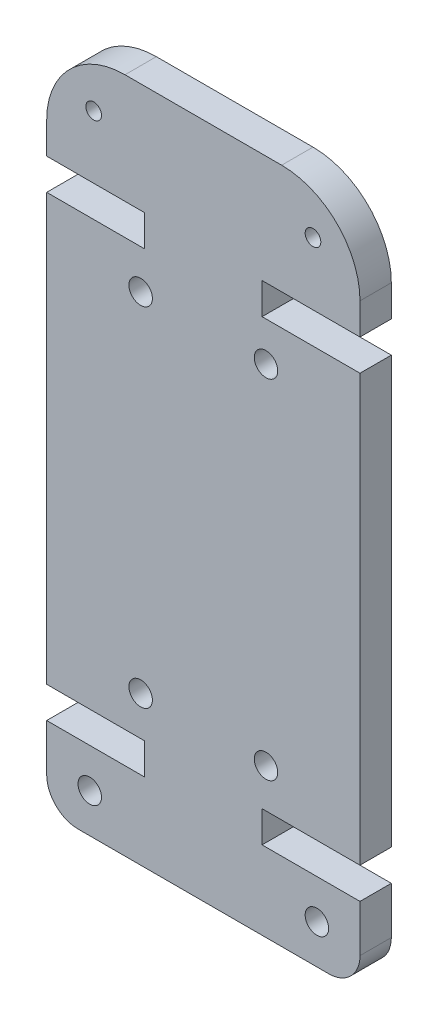
ISO-10303-21;
HEADER;
FILE_DESCRIPTION(('STEP AP214'),'2;1');
FILE_NAME('part.step','',(''),(''),'','','');
FILE_SCHEMA(('AUTOMOTIVE_DESIGN { 1 0 10303 214 1 1 1 1 }'));
ENDSEC;
DATA;
#1=APPLICATION_CONTEXT('core data for automotive mechanical design processes');
#2=APPLICATION_PROTOCOL_DEFINITION('international standard','automotive_design',2000,#1);
#3=PRODUCT_CONTEXT('',#1,'mechanical');
#4=PRODUCT('Part','Part','',(#3));
#5=PRODUCT_RELATED_PRODUCT_CATEGORY('part','',(#4));
#6=PRODUCT_DEFINITION_FORMATION('','',#4);
#7=PRODUCT_DEFINITION_CONTEXT('part definition',#1,'design');
#8=PRODUCT_DEFINITION('design','',#6,#7);
#9=PRODUCT_DEFINITION_SHAPE('','',#8);
#10=(LENGTH_UNIT() NAMED_UNIT(*) SI_UNIT(.MILLI.,.METRE.));
#11=(NAMED_UNIT(*) PLANE_ANGLE_UNIT() SI_UNIT($,.RADIAN.));
#12=(NAMED_UNIT(*) SI_UNIT($,.STERADIAN.) SOLID_ANGLE_UNIT());
#13=UNCERTAINTY_MEASURE_WITH_UNIT(LENGTH_MEASURE(1.E-05),#10,'distance_accuracy_value','');
#14=(GEOMETRIC_REPRESENTATION_CONTEXT(3) GLOBAL_UNCERTAINTY_ASSIGNED_CONTEXT((#13)) GLOBAL_UNIT_ASSIGNED_CONTEXT((#10,
#11,#12)) REPRESENTATION_CONTEXT('',''));
#15=CARTESIAN_POINT('',(0.,0.,0.));
#16=DIRECTION('',(0.,0.,1.));
#17=DIRECTION('',(1.,0.,0.));
#18=AXIS2_PLACEMENT_3D('',#15,#16,#17);
#19=CARTESIAN_POINT('',(1983.10984128656,1240.38470507667,2.));
#20=DIRECTION('',(0.,0.,1.));
#21=DIRECTION('',(1.,0.,0.));
#22=AXIS2_PLACEMENT_3D('',#19,#20,#21);
#23=PLANE('',#22);
#24=CARTESIAN_POINT('',(1982.35984128656,1240.88470507667,2.));
#25=DIRECTION('',(0.,0.,1.));
#26=DIRECTION('',(1.,0.,0.));
#27=AXIS2_PLACEMENT_3D('',#24,#25,#26);
#28=CIRCLE('',#27,0.750000000000028);
#29=CARTESIAN_POINT('',(1983.10984128656,1240.88470507667,2.));
#30=VERTEX_POINT('',#29);
#31=EDGE_CURVE('E467',#30,#30,#28,.T.);
#32=ORIENTED_EDGE('',*,*,#31,.F.);
#33=EDGE_LOOP('',(#32));
#34=FACE_BOUND('',#33,.T.);
#35=CARTESIAN_POINT('',(1979.10984128656,1270.08470507667,2.));
#36=DIRECTION('',(0.,0.,1.));
#37=DIRECTION('',(1.,0.,0.));
#38=AXIS2_PLACEMENT_3D('',#35,#36,#37);
#39=CIRCLE('',#38,0.750000000000028);
#40=CARTESIAN_POINT('',(1979.85984128656,1270.08470507667,2.));
#41=VERTEX_POINT('',#40);
#42=EDGE_CURVE('E479',#41,#41,#39,.T.);
#43=ORIENTED_EDGE('',*,*,#42,.F.);
#44=EDGE_LOOP('',(#43));
#45=FACE_BOUND('',#44,.T.);
#46=CARTESIAN_POINT('',(1979.10984128656,1247.88470507667,2.));
#47=DIRECTION('',(0.,0.,1.));
#48=DIRECTION('',(1.,0.,0.));
#49=AXIS2_PLACEMENT_3D('',#46,#47,#48);
#50=CIRCLE('',#49,0.750000000000028);
#51=CARTESIAN_POINT('',(1979.85984128656,1247.88470507667,2.));
#52=VERTEX_POINT('',#51);
#53=EDGE_CURVE('E491',#52,#52,#50,.T.);
#54=ORIENTED_EDGE('',*,*,#53,.F.);
#55=EDGE_LOOP('',(#54));
#56=FACE_BOUND('',#55,.T.);
#57=CARTESIAN_POINT('',(1968.10984128656,1278.58470507667,2.));
#58=DIRECTION('',(0.,0.,1.));
#59=DIRECTION('',(1.,0.,0.));
#60=AXIS2_PLACEMENT_3D('',#57,#58,#59);
#61=CIRCLE('',#60,0.499999999999945);
#62=CARTESIAN_POINT('',(1968.60984128656,1278.58470507667,2.));
#63=VERTEX_POINT('',#62);
#64=EDGE_CURVE('E233',#63,#63,#61,.T.);
#65=ORIENTED_EDGE('',*,*,#64,.F.);
#66=EDGE_LOOP('',(#65));
#67=FACE_BOUND('',#66,.T.);
#68=CARTESIAN_POINT('',(1983.10984128656,1240.38470507667,2.));
#69=DIRECTION('',(0.,0.,1.));
#70=DIRECTION('',(1.,0.,0.));
#71=AXIS2_PLACEMENT_3D('',#68,#69,#70);
#72=CIRCLE('',#71,1.99999999999989);
#73=CARTESIAN_POINT('',(1983.10984128656,1238.38470507667,2.));
#74=VERTEX_POINT('',#73);
#75=CARTESIAN_POINT('',(1985.10984128656,1240.38470507667,2.));
#76=VERTEX_POINT('',#75);
#77=EDGE_CURVE('E276',#74,#76,#72,.T.);
#78=ORIENTED_EDGE('',*,*,#77,.T.);
#79=DIRECTION('',(5.92118946466772E-13,1.,0.));
#80=VECTOR('',#79,1.);
#81=CARTESIAN_POINT('',(1985.10984128656,1243.38470507667,2.));
#82=LINE('',#81,#80);
#83=CARTESIAN_POINT('',(1985.10984128656,1243.38470507667,2.));
#84=VERTEX_POINT('',#83);
#85=EDGE_CURVE('E144',#76,#84,#82,.T.);
#86=ORIENTED_EDGE('',*,*,#85,.T.);
#87=DIRECTION('',(-1.,0.,0.));
#88=VECTOR('',#87,1.);
#89=CARTESIAN_POINT('',(1978.85984128656,1243.38470507667,2.));
#90=LINE('',#89,#88);
#91=CARTESIAN_POINT('',(1978.85984128656,1243.38470507667,2.));
#92=VERTEX_POINT('',#91);
#93=EDGE_CURVE('E339',#84,#92,#90,.T.);
#94=ORIENTED_EDGE('',*,*,#93,.T.);
#95=DIRECTION('',(0.,1.,0.));
#96=VECTOR('',#95,1.);
#97=CARTESIAN_POINT('',(1978.85984128656,1243.38470507667,2.));
#98=LINE('',#97,#96);
#99=CARTESIAN_POINT('',(1978.85984128656,1245.38470507667,2.));
#100=VERTEX_POINT('',#99);
#101=EDGE_CURVE('E358',#92,#100,#98,.T.);
#102=ORIENTED_EDGE('',*,*,#101,.T.);
#103=DIRECTION('',(1.,0.,0.));
#104=VECTOR('',#103,1.);
#105=CARTESIAN_POINT('',(1978.85984128656,1245.38470507667,2.));
#106=LINE('',#105,#104);
#107=CARTESIAN_POINT('',(1985.10984128656,1245.38470507667,2.));
#108=VERTEX_POINT('',#107);
#109=EDGE_CURVE('E355',#100,#108,#106,.T.);
#110=ORIENTED_EDGE('',*,*,#109,.T.);
#111=DIRECTION('',(0.,1.,0.));
#112=VECTOR('',#111,1.);
#113=CARTESIAN_POINT('',(1985.10984128656,1245.38470507667,2.));
#114=LINE('',#113,#112);
#115=CARTESIAN_POINT('',(1985.10984128656,1272.58470507667,2.));
#116=VERTEX_POINT('',#115);
#117=EDGE_CURVE('E357',#108,#116,#114,.T.);
#118=ORIENTED_EDGE('',*,*,#117,.T.);
#119=DIRECTION('',(-1.,0.,0.));
#120=VECTOR('',#119,1.);
#121=CARTESIAN_POINT('',(1978.85984128656,1272.58470507667,2.));
#122=LINE('',#121,#120);
#123=CARTESIAN_POINT('',(1978.85984128656,1272.58470507667,2.));
#124=VERTEX_POINT('',#123);
#125=EDGE_CURVE('E360',#116,#124,#122,.T.);
#126=ORIENTED_EDGE('',*,*,#125,.T.);
#127=DIRECTION('',(0.,1.,0.));
#128=VECTOR('',#127,1.);
#129=CARTESIAN_POINT('',(1978.85984128656,1274.58470507667,2.));
#130=LINE('',#129,#128);
#131=CARTESIAN_POINT('',(1978.85984128656,1274.58470507667,2.));
#132=VERTEX_POINT('',#131);
#133=EDGE_CURVE('E366',#124,#132,#130,.T.);
#134=ORIENTED_EDGE('',*,*,#133,.T.);
#135=DIRECTION('',(1.,0.,0.));
#136=VECTOR('',#135,1.);
#137=CARTESIAN_POINT('',(1978.85984128656,1274.58470507667,2.));
#138=LINE('',#137,#136);
#139=CARTESIAN_POINT('',(1985.10984128656,1274.58470507667,2.));
#140=VERTEX_POINT('',#139);
#141=EDGE_CURVE('E368',#132,#140,#138,.T.);
#142=ORIENTED_EDGE('',*,*,#141,.T.);
#143=DIRECTION('',(-1.11022302462516E-13,1.,0.));
#144=VECTOR('',#143,1.);
#145=CARTESIAN_POINT('',(1985.10984128656,1274.58470507667,2.));
#146=LINE('',#145,#144);
#147=CARTESIAN_POINT('',(1985.10984128656,1276.58470507667,2.));
#148=VERTEX_POINT('',#147);
#149=EDGE_CURVE('E370',#140,#148,#146,.T.);
#150=ORIENTED_EDGE('',*,*,#149,.T.);
#151=CARTESIAN_POINT('',(1980.10984128656,1276.58470507667,2.));
#152=DIRECTION('',(0.,0.,1.));
#153=DIRECTION('',(1.,0.,0.));
#154=AXIS2_PLACEMENT_3D('',#151,#152,#153);
#155=CIRCLE('',#154,5.00000000000012);
#156=CARTESIAN_POINT('',(1980.10984128656,1281.58470507667,2.));
#157=VERTEX_POINT('',#156);
#158=EDGE_CURVE('E372',#148,#157,#155,.T.);
#159=ORIENTED_EDGE('',*,*,#158,.T.);
#160=DIRECTION('',(-1.,0.,0.));
#161=VECTOR('',#160,1.);
#162=CARTESIAN_POINT('',(1970.10984128656,1281.58470507667,2.));
#163=LINE('',#162,#161);
#164=CARTESIAN_POINT('',(1970.10984128656,1281.58470507667,2.));
#165=VERTEX_POINT('',#164);
#166=EDGE_CURVE('E374',#157,#165,#163,.T.);
#167=ORIENTED_EDGE('',*,*,#166,.T.);
#168=CARTESIAN_POINT('',(1970.10984128656,1276.58470507667,2.));
#169=DIRECTION('',(0.,0.,1.));
#170=DIRECTION('',(1.,0.,0.));
#171=AXIS2_PLACEMENT_3D('',#168,#169,#170);
#172=CIRCLE('',#171,5.);
#173=CARTESIAN_POINT('',(1965.10984128656,1276.58470507667,2.));
#174=VERTEX_POINT('',#173);
#175=EDGE_CURVE('E376',#165,#174,#172,.T.);
#176=ORIENTED_EDGE('',*,*,#175,.T.);
#177=DIRECTION('',(0.,-1.,0.));
#178=VECTOR('',#177,1.);
#179=CARTESIAN_POINT('',(1965.10984128656,1276.58470507667,2.));
#180=LINE('',#179,#178);
#181=CARTESIAN_POINT('',(1965.10984128656,1274.58470507667,2.));
#182=VERTEX_POINT('',#181);
#183=EDGE_CURVE('E378',#174,#182,#180,.T.);
#184=ORIENTED_EDGE('',*,*,#183,.T.);
#185=DIRECTION('',(1.,0.,0.));
#186=VECTOR('',#185,1.);
#187=CARTESIAN_POINT('',(1971.35984128656,1274.58470507667,2.));
#188=LINE('',#187,#186);
#189=CARTESIAN_POINT('',(1971.35984128656,1274.58470507667,2.));
#190=VERTEX_POINT('',#189);
#191=EDGE_CURVE('E380',#182,#190,#188,.T.);
#192=ORIENTED_EDGE('',*,*,#191,.T.);
#193=DIRECTION('',(0.,-1.,0.));
#194=VECTOR('',#193,1.);
#195=CARTESIAN_POINT('',(1971.35984128656,1274.58470507667,2.));
#196=LINE('',#195,#194);
#197=CARTESIAN_POINT('',(1971.35984128656,1272.58470507667,2.));
#198=VERTEX_POINT('',#197);
#199=EDGE_CURVE('E382',#190,#198,#196,.T.);
#200=ORIENTED_EDGE('',*,*,#199,.T.);
#201=DIRECTION('',(-1.,0.,0.));
#202=VECTOR('',#201,1.);
#203=CARTESIAN_POINT('',(1971.35984128656,1272.58470507667,2.));
#204=LINE('',#203,#202);
#205=CARTESIAN_POINT('',(1965.10984128656,1272.58470507667,2.));
#206=VERTEX_POINT('',#205);
#207=EDGE_CURVE('E384',#198,#206,#204,.T.);
#208=ORIENTED_EDGE('',*,*,#207,.T.);
#209=DIRECTION('',(0.,-1.,0.));
#210=VECTOR('',#209,1.);
#211=CARTESIAN_POINT('',(1965.10984128656,1272.58470507667,2.));
#212=LINE('',#211,#210);
#213=CARTESIAN_POINT('',(1965.10984128656,1245.38470507667,2.));
#214=VERTEX_POINT('',#213);
#215=EDGE_CURVE('E386',#206,#214,#212,.T.);
#216=ORIENTED_EDGE('',*,*,#215,.T.);
#217=DIRECTION('',(1.,0.,0.));
#218=VECTOR('',#217,1.);
#219=CARTESIAN_POINT('',(1971.35984128656,1245.38470507667,2.));
#220=LINE('',#219,#218);
#221=CARTESIAN_POINT('',(1971.35984128656,1245.38470507667,2.));
#222=VERTEX_POINT('',#221);
#223=EDGE_CURVE('E388',#214,#222,#220,.T.);
#224=ORIENTED_EDGE('',*,*,#223,.T.);
#225=DIRECTION('',(0.,-1.,0.));
#226=VECTOR('',#225,1.);
#227=CARTESIAN_POINT('',(1971.35984128656,1243.38470507667,2.));
#228=LINE('',#227,#226);
#229=CARTESIAN_POINT('',(1971.35984128656,1243.38470507667,2.));
#230=VERTEX_POINT('',#229);
#231=EDGE_CURVE('E390',#222,#230,#228,.T.);
#232=ORIENTED_EDGE('',*,*,#231,.T.);
#233=DIRECTION('',(-1.,0.,0.));
#234=VECTOR('',#233,1.);
#235=CARTESIAN_POINT('',(1971.35984128656,1243.38470507667,2.));
#236=LINE('',#235,#234);
#237=CARTESIAN_POINT('',(1965.10984128656,1243.38470507667,2.));
#238=VERTEX_POINT('',#237);
#239=EDGE_CURVE('E211',#230,#238,#236,.T.);
#240=ORIENTED_EDGE('',*,*,#239,.T.);
#241=DIRECTION('',(0.,-1.,0.));
#242=VECTOR('',#241,1.);
#243=CARTESIAN_POINT('',(1965.10984128656,1243.38470507667,2.));
#244=LINE('',#243,#242);
#245=CARTESIAN_POINT('',(1965.10984128656,1240.38470507667,2.));
#246=VERTEX_POINT('',#245);
#247=EDGE_CURVE('E205',#238,#246,#244,.T.);
#248=ORIENTED_EDGE('',*,*,#247,.T.);
#249=CARTESIAN_POINT('',(1967.10984128656,1240.38470507667,2.));
#250=DIRECTION('',(0.,0.,1.));
#251=DIRECTION('',(1.,0.,0.));
#252=AXIS2_PLACEMENT_3D('',#249,#250,#251);
#253=CIRCLE('',#252,1.99999999999989);
#254=CARTESIAN_POINT('',(1967.10984128656,1238.38470507667,2.));
#255=VERTEX_POINT('',#254);
#256=EDGE_CURVE('E209',#246,#255,#253,.T.);
#257=ORIENTED_EDGE('',*,*,#256,.T.);
#258=DIRECTION('',(1.,0.,0.));
#259=VECTOR('',#258,1.);
#260=CARTESIAN_POINT('',(1967.10984128656,1238.38470507667,2.));
#261=LINE('',#260,#259);
#262=EDGE_CURVE('E53',#255,#74,#261,.T.);
#263=ORIENTED_EDGE('',*,*,#262,.T.);
#264=EDGE_LOOP('',(#78,#86,#94,#102,#110,#118,#126,#134,#142,#150,#159,#167,#176,#184,#192,#200,
#208,#216,#224,#232,#240,#248,#257,#263));
#265=FACE_BOUND('',#264,.T.);
#266=CARTESIAN_POINT('',(1982.10984128656,1278.58470507667,2.));
#267=DIRECTION('',(0.,0.,1.));
#268=DIRECTION('',(1.,0.,0.));
#269=AXIS2_PLACEMENT_3D('',#266,#267,#268);
#270=CIRCLE('',#269,0.499999999999945);
#271=CARTESIAN_POINT('',(1982.60984128656,1278.58470507667,2.));
#272=VERTEX_POINT('',#271);
#273=EDGE_CURVE('E497',#272,#272,#270,.T.);
#274=ORIENTED_EDGE('',*,*,#273,.F.);
#275=EDGE_LOOP('',(#274));
#276=FACE_BOUND('',#275,.T.);
#277=CARTESIAN_POINT('',(1971.10984128656,1247.88470507667,2.));
#278=DIRECTION('',(0.,0.,1.));
#279=DIRECTION('',(1.,0.,0.));
#280=AXIS2_PLACEMENT_3D('',#277,#278,#279);
#281=CIRCLE('',#280,0.750000000000028);
#282=CARTESIAN_POINT('',(1971.85984128656,1247.88470507667,2.));
#283=VERTEX_POINT('',#282);
#284=EDGE_CURVE('E485',#283,#283,#281,.T.);
#285=ORIENTED_EDGE('',*,*,#284,.F.);
#286=EDGE_LOOP('',(#285));
#287=FACE_BOUND('',#286,.T.);
#288=CARTESIAN_POINT('',(1971.10984128656,1270.08470507667,2.));
#289=DIRECTION('',(0.,0.,1.));
#290=DIRECTION('',(1.,0.,0.));
#291=AXIS2_PLACEMENT_3D('',#288,#289,#290);
#292=CIRCLE('',#291,0.750000000000028);
#293=CARTESIAN_POINT('',(1971.85984128656,1270.08470507667,2.));
#294=VERTEX_POINT('',#293);
#295=EDGE_CURVE('E473',#294,#294,#292,.T.);
#296=ORIENTED_EDGE('',*,*,#295,.F.);
#297=EDGE_LOOP('',(#296));
#298=FACE_BOUND('',#297,.T.);
#299=CARTESIAN_POINT('',(1967.85984128656,1240.88470507667,2.));
#300=DIRECTION('',(0.,0.,1.));
#301=DIRECTION('',(1.,0.,0.));
#302=AXIS2_PLACEMENT_3D('',#299,#300,#301);
#303=CIRCLE('',#302,0.750000000000028);
#304=CARTESIAN_POINT('',(1968.60984128656,1240.88470507667,2.));
#305=VERTEX_POINT('',#304);
#306=EDGE_CURVE('E458',#305,#305,#303,.T.);
#307=ORIENTED_EDGE('',*,*,#306,.F.);
#308=EDGE_LOOP('',(#307));
#309=FACE_BOUND('',#308,.T.);
#310=ADVANCED_FACE('F36',(#34,#45,#56,#67,#265,#276,#287,#298,#309),#23,.T.);
#311=CARTESIAN_POINT('',(1983.10984128656,1240.38470507667,0.));
#312=DIRECTION('',(0.,0.,1.));
#313=DIRECTION('',(1.,0.,0.));
#314=AXIS2_PLACEMENT_3D('',#311,#312,#313);
#315=PLANE('',#314);
#316=CARTESIAN_POINT('',(1982.35984128656,1240.88470507667,0.));
#317=DIRECTION('',(0.,0.,1.));
#318=DIRECTION('',(1.,0.,0.));
#319=AXIS2_PLACEMENT_3D('',#316,#317,#318);
#320=CIRCLE('',#319,0.750000000000028);
#321=CARTESIAN_POINT('',(1983.10984128656,1240.88470507667,0.));
#322=VERTEX_POINT('',#321);
#323=EDGE_CURVE('E464',#322,#322,#320,.T.);
#324=ORIENTED_EDGE('',*,*,#323,.T.);
#325=EDGE_LOOP('',(#324));
#326=FACE_BOUND('',#325,.T.);
#327=CARTESIAN_POINT('',(1979.10984128656,1270.08470507667,0.));
#328=DIRECTION('',(0.,0.,1.));
#329=DIRECTION('',(1.,0.,0.));
#330=AXIS2_PLACEMENT_3D('',#327,#328,#329);
#331=CIRCLE('',#330,0.750000000000028);
#332=CARTESIAN_POINT('',(1979.85984128656,1270.08470507667,0.));
#333=VERTEX_POINT('',#332);
#334=EDGE_CURVE('E476',#333,#333,#331,.T.);
#335=ORIENTED_EDGE('',*,*,#334,.T.);
#336=EDGE_LOOP('',(#335));
#337=FACE_BOUND('',#336,.T.);
#338=CARTESIAN_POINT('',(1979.10984128656,1247.88470507667,0.));
#339=DIRECTION('',(0.,0.,1.));
#340=DIRECTION('',(1.,0.,0.));
#341=AXIS2_PLACEMENT_3D('',#338,#339,#340);
#342=CIRCLE('',#341,0.750000000000028);
#343=CARTESIAN_POINT('',(1979.85984128656,1247.88470507667,0.));
#344=VERTEX_POINT('',#343);
#345=EDGE_CURVE('E488',#344,#344,#342,.T.);
#346=ORIENTED_EDGE('',*,*,#345,.T.);
#347=EDGE_LOOP('',(#346));
#348=FACE_BOUND('',#347,.T.);
#349=CARTESIAN_POINT('',(1968.10984128656,1278.58470507667,0.));
#350=DIRECTION('',(0.,0.,1.));
#351=DIRECTION('',(1.,0.,0.));
#352=AXIS2_PLACEMENT_3D('',#349,#350,#351);
#353=CIRCLE('',#352,0.499999999999945);
#354=CARTESIAN_POINT('',(1968.60984128656,1278.58470507667,0.));
#355=VERTEX_POINT('',#354);
#356=EDGE_CURVE('E500',#355,#355,#353,.T.);
#357=ORIENTED_EDGE('',*,*,#356,.T.);
#358=EDGE_LOOP('',(#357));
#359=FACE_BOUND('',#358,.T.);
#360=CARTESIAN_POINT('',(1983.10984128656,1240.38470507667,0.));
#361=DIRECTION('',(0.,0.,1.));
#362=DIRECTION('',(1.,0.,0.));
#363=AXIS2_PLACEMENT_3D('',#360,#361,#362);
#364=CIRCLE('',#363,1.99999999999989);
#365=CARTESIAN_POINT('',(1983.10984128656,1238.38470507667,0.));
#366=VERTEX_POINT('',#365);
#367=CARTESIAN_POINT('',(1985.10984128656,1240.38470507667,0.));
#368=VERTEX_POINT('',#367);
#369=EDGE_CURVE('E229',#366,#368,#364,.T.);
#370=ORIENTED_EDGE('',*,*,#369,.F.);
#371=DIRECTION('',(1.,0.,0.));
#372=VECTOR('',#371,1.);
#373=CARTESIAN_POINT('',(1967.10984128656,1238.38470507667,0.));
#374=LINE('',#373,#372);
#375=CARTESIAN_POINT('',(1967.10984128656,1238.38470507667,0.));
#376=VERTEX_POINT('',#375);
#377=EDGE_CURVE('E136',#376,#366,#374,.T.);
#378=ORIENTED_EDGE('',*,*,#377,.F.);
#379=CARTESIAN_POINT('',(1967.10984128656,1240.38470507667,0.));
#380=DIRECTION('',(0.,0.,1.));
#381=DIRECTION('',(1.,0.,0.));
#382=AXIS2_PLACEMENT_3D('',#379,#380,#381);
#383=CIRCLE('',#382,1.99999999999989);
#384=CARTESIAN_POINT('',(1965.10984128656,1240.38470507667,0.));
#385=VERTEX_POINT('',#384);
#386=EDGE_CURVE('E130',#385,#376,#383,.T.);
#387=ORIENTED_EDGE('',*,*,#386,.F.);
#388=DIRECTION('',(0.,-1.,0.));
#389=VECTOR('',#388,1.);
#390=CARTESIAN_POINT('',(1965.10984128656,1243.38470507667,0.));
#391=LINE('',#390,#389);
#392=CARTESIAN_POINT('',(1965.10984128656,1243.38470507667,0.));
#393=VERTEX_POINT('',#392);
#394=EDGE_CURVE('E219',#393,#385,#391,.T.);
#395=ORIENTED_EDGE('',*,*,#394,.F.);
#396=DIRECTION('',(-1.,0.,0.));
#397=VECTOR('',#396,1.);
#398=CARTESIAN_POINT('',(1971.35984128656,1243.38470507667,0.));
#399=LINE('',#398,#397);
#400=CARTESIAN_POINT('',(1971.35984128656,1243.38470507667,0.));
#401=VERTEX_POINT('',#400);
#402=EDGE_CURVE('E271',#401,#393,#399,.T.);
#403=ORIENTED_EDGE('',*,*,#402,.F.);
#404=DIRECTION('',(0.,-1.,0.));
#405=VECTOR('',#404,1.);
#406=CARTESIAN_POINT('',(1971.35984128656,1243.38470507667,0.));
#407=LINE('',#406,#405);
#408=CARTESIAN_POINT('',(1971.35984128656,1245.38470507667,0.));
#409=VERTEX_POINT('',#408);
#410=EDGE_CURVE('E269',#409,#401,#407,.T.);
#411=ORIENTED_EDGE('',*,*,#410,.F.);
#412=DIRECTION('',(1.,0.,0.));
#413=VECTOR('',#412,1.);
#414=CARTESIAN_POINT('',(1971.35984128656,1245.38470507667,0.));
#415=LINE('',#414,#413);
#416=CARTESIAN_POINT('',(1965.10984128656,1245.38470507667,0.));
#417=VERTEX_POINT('',#416);
#418=EDGE_CURVE('E267',#417,#409,#415,.T.);
#419=ORIENTED_EDGE('',*,*,#418,.F.);
#420=DIRECTION('',(0.,-1.,0.));
#421=VECTOR('',#420,1.);
#422=CARTESIAN_POINT('',(1965.10984128656,1272.58470507667,0.));
#423=LINE('',#422,#421);
#424=CARTESIAN_POINT('',(1965.10984128656,1272.58470507667,0.));
#425=VERTEX_POINT('',#424);
#426=EDGE_CURVE('E265',#425,#417,#423,.T.);
#427=ORIENTED_EDGE('',*,*,#426,.F.);
#428=DIRECTION('',(-1.,0.,0.));
#429=VECTOR('',#428,1.);
#430=CARTESIAN_POINT('',(1971.35984128656,1272.58470507667,0.));
#431=LINE('',#430,#429);
#432=CARTESIAN_POINT('',(1971.35984128656,1272.58470507667,0.));
#433=VERTEX_POINT('',#432);
#434=EDGE_CURVE('E263',#433,#425,#431,.T.);
#435=ORIENTED_EDGE('',*,*,#434,.F.);
#436=DIRECTION('',(0.,-1.,0.));
#437=VECTOR('',#436,1.);
#438=CARTESIAN_POINT('',(1971.35984128656,1274.58470507667,0.));
#439=LINE('',#438,#437);
#440=CARTESIAN_POINT('',(1971.35984128656,1274.58470507667,0.));
#441=VERTEX_POINT('',#440);
#442=EDGE_CURVE('E261',#441,#433,#439,.T.);
#443=ORIENTED_EDGE('',*,*,#442,.F.);
#444=DIRECTION('',(1.,0.,0.));
#445=VECTOR('',#444,1.);
#446=CARTESIAN_POINT('',(1971.35984128656,1274.58470507667,0.));
#447=LINE('',#446,#445);
#448=CARTESIAN_POINT('',(1965.10984128656,1274.58470507667,0.));
#449=VERTEX_POINT('',#448);
#450=EDGE_CURVE('E259',#449,#441,#447,.T.);
#451=ORIENTED_EDGE('',*,*,#450,.F.);
#452=DIRECTION('',(0.,-1.,0.));
#453=VECTOR('',#452,1.);
#454=CARTESIAN_POINT('',(1965.10984128656,1276.58470507667,0.));
#455=LINE('',#454,#453);
#456=CARTESIAN_POINT('',(1965.10984128656,1276.58470507667,0.));
#457=VERTEX_POINT('',#456);
#458=EDGE_CURVE('E257',#457,#449,#455,.T.);
#459=ORIENTED_EDGE('',*,*,#458,.F.);
#460=CARTESIAN_POINT('',(1970.10984128656,1276.58470507667,0.));
#461=DIRECTION('',(0.,0.,1.));
#462=DIRECTION('',(1.,0.,0.));
#463=AXIS2_PLACEMENT_3D('',#460,#461,#462);
#464=CIRCLE('',#463,5.);
#465=CARTESIAN_POINT('',(1970.10984128656,1281.58470507667,0.));
#466=VERTEX_POINT('',#465);
#467=EDGE_CURVE('E255',#466,#457,#464,.T.);
#468=ORIENTED_EDGE('',*,*,#467,.F.);
#469=DIRECTION('',(-1.,0.,0.));
#470=VECTOR('',#469,1.);
#471=CARTESIAN_POINT('',(1970.10984128656,1281.58470507667,0.));
#472=LINE('',#471,#470);
#473=CARTESIAN_POINT('',(1980.10984128656,1281.58470507667,0.));
#474=VERTEX_POINT('',#473);
#475=EDGE_CURVE('E253',#474,#466,#472,.T.);
#476=ORIENTED_EDGE('',*,*,#475,.F.);
#477=CARTESIAN_POINT('',(1980.10984128656,1276.58470507667,0.));
#478=DIRECTION('',(0.,0.,1.));
#479=DIRECTION('',(1.,0.,0.));
#480=AXIS2_PLACEMENT_3D('',#477,#478,#479);
#481=CIRCLE('',#480,5.00000000000012);
#482=CARTESIAN_POINT('',(1985.10984128656,1276.58470507667,0.));
#483=VERTEX_POINT('',#482);
#484=EDGE_CURVE('E251',#483,#474,#481,.T.);
#485=ORIENTED_EDGE('',*,*,#484,.F.);
#486=DIRECTION('',(-1.11022302462516E-13,1.,0.));
#487=VECTOR('',#486,1.);
#488=CARTESIAN_POINT('',(1985.10984128656,1274.58470507667,0.));
#489=LINE('',#488,#487);
#490=CARTESIAN_POINT('',(1985.10984128656,1274.58470507667,0.));
#491=VERTEX_POINT('',#490);
#492=EDGE_CURVE('E249',#491,#483,#489,.T.);
#493=ORIENTED_EDGE('',*,*,#492,.F.);
#494=DIRECTION('',(1.,0.,0.));
#495=VECTOR('',#494,1.);
#496=CARTESIAN_POINT('',(1978.85984128656,1274.58470507667,0.));
#497=LINE('',#496,#495);
#498=CARTESIAN_POINT('',(1978.85984128656,1274.58470507667,0.));
#499=VERTEX_POINT('',#498);
#500=EDGE_CURVE('E247',#499,#491,#497,.T.);
#501=ORIENTED_EDGE('',*,*,#500,.F.);
#502=DIRECTION('',(0.,1.,0.));
#503=VECTOR('',#502,1.);
#504=CARTESIAN_POINT('',(1978.85984128656,1274.58470507667,0.));
#505=LINE('',#504,#503);
#506=CARTESIAN_POINT('',(1978.85984128656,1272.58470507667,0.));
#507=VERTEX_POINT('',#506);
#508=EDGE_CURVE('E245',#507,#499,#505,.T.);
#509=ORIENTED_EDGE('',*,*,#508,.F.);
#510=DIRECTION('',(-1.,0.,0.));
#511=VECTOR('',#510,1.);
#512=CARTESIAN_POINT('',(1978.85984128656,1272.58470507667,0.));
#513=LINE('',#512,#511);
#514=CARTESIAN_POINT('',(1985.10984128656,1272.58470507667,0.));
#515=VERTEX_POINT('',#514);
#516=EDGE_CURVE('E243',#515,#507,#513,.T.);
#517=ORIENTED_EDGE('',*,*,#516,.F.);
#518=DIRECTION('',(0.,1.,0.));
#519=VECTOR('',#518,1.);
#520=CARTESIAN_POINT('',(1985.10984128656,1245.38470507667,0.));
#521=LINE('',#520,#519);
#522=CARTESIAN_POINT('',(1985.10984128656,1245.38470507667,0.));
#523=VERTEX_POINT('',#522);
#524=EDGE_CURVE('E241',#523,#515,#521,.T.);
#525=ORIENTED_EDGE('',*,*,#524,.F.);
#526=DIRECTION('',(1.,0.,0.));
#527=VECTOR('',#526,1.);
#528=CARTESIAN_POINT('',(1978.85984128656,1245.38470507667,0.));
#529=LINE('',#528,#527);
#530=CARTESIAN_POINT('',(1978.85984128656,1245.38470507667,0.));
#531=VERTEX_POINT('',#530);
#532=EDGE_CURVE('E239',#531,#523,#529,.T.);
#533=ORIENTED_EDGE('',*,*,#532,.F.);
#534=DIRECTION('',(0.,1.,0.));
#535=VECTOR('',#534,1.);
#536=CARTESIAN_POINT('',(1978.85984128656,1243.38470507667,0.));
#537=LINE('',#536,#535);
#538=CARTESIAN_POINT('',(1978.85984128656,1243.38470507667,0.));
#539=VERTEX_POINT('',#538);
#540=EDGE_CURVE('E237',#539,#531,#537,.T.);
#541=ORIENTED_EDGE('',*,*,#540,.F.);
#542=DIRECTION('',(-1.,0.,0.));
#543=VECTOR('',#542,1.);
#544=CARTESIAN_POINT('',(1978.85984128656,1243.38470507667,0.));
#545=LINE('',#544,#543);
#546=CARTESIAN_POINT('',(1985.10984128656,1243.38470507667,0.));
#547=VERTEX_POINT('',#546);
#548=EDGE_CURVE('E235',#547,#539,#545,.T.);
#549=ORIENTED_EDGE('',*,*,#548,.F.);
#550=DIRECTION('',(5.92118946466772E-13,1.,0.));
#551=VECTOR('',#550,1.);
#552=CARTESIAN_POINT('',(1985.10984128656,1243.38470507667,0.));
#553=LINE('',#552,#551);
#554=EDGE_CURVE('E232',#368,#547,#553,.T.);
#555=ORIENTED_EDGE('',*,*,#554,.F.);
#556=EDGE_LOOP('',(#370,#378,#387,#395,#403,#411,#419,#427,#435,#443,#451,#459,#468,#476,#485,
#493,#501,#509,#517,#525,#533,#541,#549,#555));
#557=FACE_BOUND('',#556,.T.);
#558=CARTESIAN_POINT('',(1982.10984128656,1278.58470507667,0.));
#559=DIRECTION('',(0.,0.,1.));
#560=DIRECTION('',(1.,0.,0.));
#561=AXIS2_PLACEMENT_3D('',#558,#559,#560);
#562=CIRCLE('',#561,0.499999999999945);
#563=CARTESIAN_POINT('',(1982.60984128656,1278.58470507667,0.));
#564=VERTEX_POINT('',#563);
#565=EDGE_CURVE('E494',#564,#564,#562,.T.);
#566=ORIENTED_EDGE('',*,*,#565,.T.);
#567=EDGE_LOOP('',(#566));
#568=FACE_BOUND('',#567,.T.);
#569=CARTESIAN_POINT('',(1971.10984128656,1247.88470507667,0.));
#570=DIRECTION('',(0.,0.,1.));
#571=DIRECTION('',(1.,0.,0.));
#572=AXIS2_PLACEMENT_3D('',#569,#570,#571);
#573=CIRCLE('',#572,0.750000000000028);
#574=CARTESIAN_POINT('',(1971.85984128656,1247.88470507667,0.));
#575=VERTEX_POINT('',#574);
#576=EDGE_CURVE('E482',#575,#575,#573,.T.);
#577=ORIENTED_EDGE('',*,*,#576,.T.);
#578=EDGE_LOOP('',(#577));
#579=FACE_BOUND('',#578,.T.);
#580=CARTESIAN_POINT('',(1971.10984128656,1270.08470507667,0.));
#581=DIRECTION('',(0.,0.,1.));
#582=DIRECTION('',(1.,0.,0.));
#583=AXIS2_PLACEMENT_3D('',#580,#581,#582);
#584=CIRCLE('',#583,0.750000000000028);
#585=CARTESIAN_POINT('',(1971.85984128656,1270.08470507667,0.));
#586=VERTEX_POINT('',#585);
#587=EDGE_CURVE('E470',#586,#586,#584,.T.);
#588=ORIENTED_EDGE('',*,*,#587,.T.);
#589=EDGE_LOOP('',(#588));
#590=FACE_BOUND('',#589,.T.);
#591=CARTESIAN_POINT('',(1967.85984128656,1240.88470507667,0.));
#592=DIRECTION('',(0.,0.,1.));
#593=DIRECTION('',(1.,0.,0.));
#594=AXIS2_PLACEMENT_3D('',#591,#592,#593);
#595=CIRCLE('',#594,0.750000000000028);
#596=CARTESIAN_POINT('',(1968.60984128656,1240.88470507667,0.));
#597=VERTEX_POINT('',#596);
#598=EDGE_CURVE('E461',#597,#597,#595,.T.);
#599=ORIENTED_EDGE('',*,*,#598,.T.);
#600=EDGE_LOOP('',(#599));
#601=FACE_BOUND('',#600,.T.);
#602=ADVANCED_FACE('F343',(#326,#337,#348,#359,#557,#568,#579,#590,#601),#315,.F.);
#603=CARTESIAN_POINT('',(1983.10984128656,1240.38470507667,2.));
#604=DIRECTION('',(0.,0.,-1.));
#605=DIRECTION('',(-1.,0.,0.));
#606=AXIS2_PLACEMENT_3D('',#603,#604,#605);
#607=CYLINDRICAL_SURFACE('',#606,1.99999999999989);
#608=ORIENTED_EDGE('',*,*,#369,.T.);
#609=DIRECTION('',(0.,0.,-1.));
#610=VECTOR('',#609,1.);
#611=CARTESIAN_POINT('',(1985.10984128656,1240.38470507667,2.));
#612=LINE('',#611,#610);
#613=EDGE_CURVE('E11',#76,#368,#612,.T.);
#614=ORIENTED_EDGE('',*,*,#613,.F.);
#615=ORIENTED_EDGE('',*,*,#77,.F.);
#616=DIRECTION('',(0.,0.,-1.));
#617=VECTOR('',#616,1.);
#618=CARTESIAN_POINT('',(1983.10984128656,1238.38470507667,2.));
#619=LINE('',#618,#617);
#620=EDGE_CURVE('E225',#74,#366,#619,.T.);
#621=ORIENTED_EDGE('',*,*,#620,.T.);
#622=EDGE_LOOP('',(#608,#614,#615,#621));
#623=FACE_BOUND('',#622,.T.);
#624=ADVANCED_FACE('F38',(#623),#607,.T.);
#625=CARTESIAN_POINT('',(1985.10984128656,1243.38470507667,2.));
#626=DIRECTION('',(-1.,5.92118946466772E-13,0.));
#627=DIRECTION('',(-5.92118946466772E-13,-1.,0.));
#628=AXIS2_PLACEMENT_3D('',#625,#626,#627);
#629=PLANE('',#628);
#630=ORIENTED_EDGE('',*,*,#554,.T.);
#631=DIRECTION('',(0.,0.,-1.));
#632=VECTOR('',#631,1.);
#633=CARTESIAN_POINT('',(1985.10984128656,1243.38470507667,2.));
#634=LINE('',#633,#632);
#635=EDGE_CURVE('E45',#84,#547,#634,.T.);
#636=ORIENTED_EDGE('',*,*,#635,.F.);
#637=ORIENTED_EDGE('',*,*,#85,.F.);
#638=ORIENTED_EDGE('',*,*,#613,.T.);
#639=EDGE_LOOP('',(#630,#636,#637,#638));
#640=FACE_BOUND('',#639,.T.);
#641=ADVANCED_FACE('F735',(#640),#629,.F.);
#642=CARTESIAN_POINT('',(1978.85984128656,1243.38470507667,2.));
#643=DIRECTION('',(0.,-1.,0.));
#644=DIRECTION('',(0.,0.,-1.));
#645=AXIS2_PLACEMENT_3D('',#642,#643,#644);
#646=PLANE('',#645);
#647=ORIENTED_EDGE('',*,*,#548,.T.);
#648=DIRECTION('',(0.,0.,-1.));
#649=VECTOR('',#648,1.);
#650=CARTESIAN_POINT('',(1978.85984128656,1243.38470507667,2.));
#651=LINE('',#650,#649);
#652=EDGE_CURVE('E331',#92,#539,#651,.T.);
#653=ORIENTED_EDGE('',*,*,#652,.F.);
#654=ORIENTED_EDGE('',*,*,#93,.F.);
#655=ORIENTED_EDGE('',*,*,#635,.T.);
#656=EDGE_LOOP('',(#647,#653,#654,#655));
#657=FACE_BOUND('',#656,.T.);
#658=ADVANCED_FACE('F337',(#657),#646,.F.);
#659=CARTESIAN_POINT('',(1978.85984128656,1243.38470507667,2.));
#660=DIRECTION('',(-1.,0.,0.));
#661=DIRECTION('',(0.,0.,1.));
#662=AXIS2_PLACEMENT_3D('',#659,#660,#661);
#663=PLANE('',#662);
#664=ORIENTED_EDGE('',*,*,#540,.T.);
#665=DIRECTION('',(0.,0.,-1.));
#666=VECTOR('',#665,1.);
#667=CARTESIAN_POINT('',(1978.85984128656,1245.38470507667,2.));
#668=LINE('',#667,#666);
#669=EDGE_CURVE('E328',#100,#531,#668,.T.);
#670=ORIENTED_EDGE('',*,*,#669,.F.);
#671=ORIENTED_EDGE('',*,*,#101,.F.);
#672=ORIENTED_EDGE('',*,*,#652,.T.);
#673=EDGE_LOOP('',(#664,#670,#671,#672));
#674=FACE_BOUND('',#673,.T.);
#675=ADVANCED_FACE('F349',(#674),#663,.F.);
#676=CARTESIAN_POINT('',(1978.85984128656,1245.38470507667,2.));
#677=DIRECTION('',(0.,1.,0.));
#678=DIRECTION('',(-1.,0.,0.));
#679=AXIS2_PLACEMENT_3D('',#676,#677,#678);
#680=PLANE('',#679);
#681=ORIENTED_EDGE('',*,*,#532,.T.);
#682=DIRECTION('',(0.,0.,-1.));
#683=VECTOR('',#682,1.);
#684=CARTESIAN_POINT('',(1985.10984128656,1245.38470507667,2.));
#685=LINE('',#684,#683);
#686=EDGE_CURVE('E325',#108,#523,#685,.T.);
#687=ORIENTED_EDGE('',*,*,#686,.F.);
#688=ORIENTED_EDGE('',*,*,#109,.F.);
#689=ORIENTED_EDGE('',*,*,#669,.T.);
#690=EDGE_LOOP('',(#681,#687,#688,#689));
#691=FACE_BOUND('',#690,.T.);
#692=ADVANCED_FACE('F353',(#691),#680,.F.);
#693=CARTESIAN_POINT('',(1985.10984128656,1245.38470507667,2.));
#694=DIRECTION('',(-1.,0.,0.));
#695=DIRECTION('',(0.,0.,1.));
#696=AXIS2_PLACEMENT_3D('',#693,#694,#695);
#697=PLANE('',#696);
#698=ORIENTED_EDGE('',*,*,#524,.T.);
#699=DIRECTION('',(0.,0.,-1.));
#700=VECTOR('',#699,1.);
#701=CARTESIAN_POINT('',(1985.10984128656,1272.58470507667,2.));
#702=LINE('',#701,#700);
#703=EDGE_CURVE('E322',#116,#515,#702,.T.);
#704=ORIENTED_EDGE('',*,*,#703,.F.);
#705=ORIENTED_EDGE('',*,*,#117,.F.);
#706=ORIENTED_EDGE('',*,*,#686,.T.);
#707=EDGE_LOOP('',(#698,#704,#705,#706));
#708=FACE_BOUND('',#707,.T.);
#709=ADVANCED_FACE('F704',(#708),#697,.F.);
#710=CARTESIAN_POINT('',(1978.85984128656,1272.58470507667,2.));
#711=DIRECTION('',(0.,-1.,0.));
#712=DIRECTION('',(1.,0.,0.));
#713=AXIS2_PLACEMENT_3D('',#710,#711,#712);
#714=PLANE('',#713);
#715=ORIENTED_EDGE('',*,*,#516,.T.);
#716=DIRECTION('',(0.,0.,-1.));
#717=VECTOR('',#716,1.);
#718=CARTESIAN_POINT('',(1978.85984128656,1272.58470507667,2.));
#719=LINE('',#718,#717);
#720=EDGE_CURVE('E319',#124,#507,#719,.T.);
#721=ORIENTED_EDGE('',*,*,#720,.F.);
#722=ORIENTED_EDGE('',*,*,#125,.F.);
#723=ORIENTED_EDGE('',*,*,#703,.T.);
#724=EDGE_LOOP('',(#715,#721,#722,#723));
#725=FACE_BOUND('',#724,.T.);
#726=ADVANCED_FACE('F695',(#725),#714,.F.);
#727=CARTESIAN_POINT('',(1978.85984128656,1274.58470507667,2.));
#728=DIRECTION('',(-1.,0.,0.));
#729=DIRECTION('',(0.,0.,1.));
#730=AXIS2_PLACEMENT_3D('',#727,#728,#729);
#731=PLANE('',#730);
#732=ORIENTED_EDGE('',*,*,#508,.T.);
#733=DIRECTION('',(0.,0.,-1.));
#734=VECTOR('',#733,1.);
#735=CARTESIAN_POINT('',(1978.85984128656,1274.58470507667,2.));
#736=LINE('',#735,#734);
#737=EDGE_CURVE('E316',#132,#499,#736,.T.);
#738=ORIENTED_EDGE('',*,*,#737,.F.);
#739=ORIENTED_EDGE('',*,*,#133,.F.);
#740=ORIENTED_EDGE('',*,*,#720,.T.);
#741=EDGE_LOOP('',(#732,#738,#739,#740));
#742=FACE_BOUND('',#741,.T.);
#743=ADVANCED_FACE('F686',(#742),#731,.F.);
#744=CARTESIAN_POINT('',(1978.85984128656,1274.58470507667,2.));
#745=DIRECTION('',(0.,1.,0.));
#746=DIRECTION('',(0.,0.,1.));
#747=AXIS2_PLACEMENT_3D('',#744,#745,#746);
#748=PLANE('',#747);
#749=ORIENTED_EDGE('',*,*,#500,.T.);
#750=DIRECTION('',(0.,0.,-1.));
#751=VECTOR('',#750,1.);
#752=CARTESIAN_POINT('',(1985.10984128656,1274.58470507667,2.));
#753=LINE('',#752,#751);
#754=EDGE_CURVE('E313',#140,#491,#753,.T.);
#755=ORIENTED_EDGE('',*,*,#754,.F.);
#756=ORIENTED_EDGE('',*,*,#141,.F.);
#757=ORIENTED_EDGE('',*,*,#737,.T.);
#758=EDGE_LOOP('',(#749,#755,#756,#757));
#759=FACE_BOUND('',#758,.T.);
#760=ADVANCED_FACE('F677',(#759),#748,.F.);
#761=CARTESIAN_POINT('',(1985.10984128656,1274.58470507667,2.));
#762=DIRECTION('',(-1.,-1.11022302462516E-13,0.));
#763=DIRECTION('',(1.11022302462516E-13,-1.,0.));
#764=AXIS2_PLACEMENT_3D('',#761,#762,#763);
#765=PLANE('',#764);
#766=ORIENTED_EDGE('',*,*,#492,.T.);
#767=DIRECTION('',(0.,0.,-1.));
#768=VECTOR('',#767,1.);
#769=CARTESIAN_POINT('',(1985.10984128656,1276.58470507667,2.));
#770=LINE('',#769,#768);
#771=EDGE_CURVE('E310',#148,#483,#770,.T.);
#772=ORIENTED_EDGE('',*,*,#771,.F.);
#773=ORIENTED_EDGE('',*,*,#149,.F.);
#774=ORIENTED_EDGE('',*,*,#754,.T.);
#775=EDGE_LOOP('',(#766,#772,#773,#774));
#776=FACE_BOUND('',#775,.T.);
#777=ADVANCED_FACE('F668',(#776),#765,.F.);
#778=CARTESIAN_POINT('',(1980.10984128656,1276.58470507667,2.));
#779=DIRECTION('',(0.,0.,-1.));
#780=DIRECTION('',(-1.,0.,0.));
#781=AXIS2_PLACEMENT_3D('',#778,#779,#780);
#782=CYLINDRICAL_SURFACE('',#781,5.00000000000012);
#783=ORIENTED_EDGE('',*,*,#484,.T.);
#784=DIRECTION('',(0.,0.,-1.));
#785=VECTOR('',#784,1.);
#786=CARTESIAN_POINT('',(1980.10984128656,1281.58470507667,2.));
#787=LINE('',#786,#785);
#788=EDGE_CURVE('E307',#157,#474,#787,.T.);
#789=ORIENTED_EDGE('',*,*,#788,.F.);
#790=ORIENTED_EDGE('',*,*,#158,.F.);
#791=ORIENTED_EDGE('',*,*,#771,.T.);
#792=EDGE_LOOP('',(#783,#789,#790,#791));
#793=FACE_BOUND('',#792,.T.);
#794=ADVANCED_FACE('F659',(#793),#782,.T.);
#795=CARTESIAN_POINT('',(1970.10984128656,1281.58470507667,2.));
#796=DIRECTION('',(0.,-1.,0.));
#797=DIRECTION('',(0.,0.,-1.));
#798=AXIS2_PLACEMENT_3D('',#795,#796,#797);
#799=PLANE('',#798);
#800=ORIENTED_EDGE('',*,*,#475,.T.);
#801=DIRECTION('',(0.,0.,-1.));
#802=VECTOR('',#801,1.);
#803=CARTESIAN_POINT('',(1970.10984128656,1281.58470507667,2.));
#804=LINE('',#803,#802);
#805=EDGE_CURVE('E304',#165,#466,#804,.T.);
#806=ORIENTED_EDGE('',*,*,#805,.F.);
#807=ORIENTED_EDGE('',*,*,#166,.F.);
#808=ORIENTED_EDGE('',*,*,#788,.T.);
#809=EDGE_LOOP('',(#800,#806,#807,#808));
#810=FACE_BOUND('',#809,.T.);
#811=ADVANCED_FACE('F650',(#810),#799,.F.);
#812=CARTESIAN_POINT('',(1970.10984128656,1276.58470507667,2.));
#813=DIRECTION('',(0.,0.,-1.));
#814=DIRECTION('',(-1.,0.,0.));
#815=AXIS2_PLACEMENT_3D('',#812,#813,#814);
#816=CYLINDRICAL_SURFACE('',#815,5.);
#817=ORIENTED_EDGE('',*,*,#467,.T.);
#818=DIRECTION('',(0.,0.,-1.));
#819=VECTOR('',#818,1.);
#820=CARTESIAN_POINT('',(1965.10984128656,1276.58470507667,2.));
#821=LINE('',#820,#819);
#822=EDGE_CURVE('E301',#174,#457,#821,.T.);
#823=ORIENTED_EDGE('',*,*,#822,.F.);
#824=ORIENTED_EDGE('',*,*,#175,.F.);
#825=ORIENTED_EDGE('',*,*,#805,.T.);
#826=EDGE_LOOP('',(#817,#823,#824,#825));
#827=FACE_BOUND('',#826,.T.);
#828=ADVANCED_FACE('F641',(#827),#816,.T.);
#829=CARTESIAN_POINT('',(1965.10984128656,1276.58470507667,2.));
#830=DIRECTION('',(1.,0.,0.));
#831=DIRECTION('',(0.,0.,-1.));
#832=AXIS2_PLACEMENT_3D('',#829,#830,#831);
#833=PLANE('',#832);
#834=ORIENTED_EDGE('',*,*,#458,.T.);
#835=DIRECTION('',(0.,0.,-1.));
#836=VECTOR('',#835,1.);
#837=CARTESIAN_POINT('',(1965.10984128656,1274.58470507667,2.));
#838=LINE('',#837,#836);
#839=EDGE_CURVE('E298',#182,#449,#838,.T.);
#840=ORIENTED_EDGE('',*,*,#839,.F.);
#841=ORIENTED_EDGE('',*,*,#183,.F.);
#842=ORIENTED_EDGE('',*,*,#822,.T.);
#843=EDGE_LOOP('',(#834,#840,#841,#842));
#844=FACE_BOUND('',#843,.T.);
#845=ADVANCED_FACE('F632',(#844),#833,.F.);
#846=CARTESIAN_POINT('',(1971.35984128656,1274.58470507667,2.));
#847=DIRECTION('',(0.,1.,0.));
#848=DIRECTION('',(0.,0.,1.));
#849=AXIS2_PLACEMENT_3D('',#846,#847,#848);
#850=PLANE('',#849);
#851=ORIENTED_EDGE('',*,*,#450,.T.);
#852=DIRECTION('',(0.,0.,-1.));
#853=VECTOR('',#852,1.);
#854=CARTESIAN_POINT('',(1971.35984128656,1274.58470507667,2.));
#855=LINE('',#854,#853);
#856=EDGE_CURVE('E295',#190,#441,#855,.T.);
#857=ORIENTED_EDGE('',*,*,#856,.F.);
#858=ORIENTED_EDGE('',*,*,#191,.F.);
#859=ORIENTED_EDGE('',*,*,#839,.T.);
#860=EDGE_LOOP('',(#851,#857,#858,#859));
#861=FACE_BOUND('',#860,.T.);
#862=ADVANCED_FACE('F623',(#861),#850,.F.);
#863=CARTESIAN_POINT('',(1971.35984128656,1274.58470507667,2.));
#864=DIRECTION('',(1.,0.,0.));
#865=DIRECTION('',(0.,0.,-1.));
#866=AXIS2_PLACEMENT_3D('',#863,#864,#865);
#867=PLANE('',#866);
#868=ORIENTED_EDGE('',*,*,#442,.T.);
#869=DIRECTION('',(0.,0.,-1.));
#870=VECTOR('',#869,1.);
#871=CARTESIAN_POINT('',(1971.35984128656,1272.58470507667,2.));
#872=LINE('',#871,#870);
#873=EDGE_CURVE('E292',#198,#433,#872,.T.);
#874=ORIENTED_EDGE('',*,*,#873,.F.);
#875=ORIENTED_EDGE('',*,*,#199,.F.);
#876=ORIENTED_EDGE('',*,*,#856,.T.);
#877=EDGE_LOOP('',(#868,#874,#875,#876));
#878=FACE_BOUND('',#877,.T.);
#879=ADVANCED_FACE('F614',(#878),#867,.F.);
#880=CARTESIAN_POINT('',(1971.35984128656,1272.58470507667,2.));
#881=DIRECTION('',(0.,-1.,0.));
#882=DIRECTION('',(0.,0.,-1.));
#883=AXIS2_PLACEMENT_3D('',#880,#881,#882);
#884=PLANE('',#883);
#885=ORIENTED_EDGE('',*,*,#434,.T.);
#886=DIRECTION('',(0.,0.,-1.));
#887=VECTOR('',#886,1.);
#888=CARTESIAN_POINT('',(1965.10984128656,1272.58470507667,2.));
#889=LINE('',#888,#887);
#890=EDGE_CURVE('E289',#206,#425,#889,.T.);
#891=ORIENTED_EDGE('',*,*,#890,.F.);
#892=ORIENTED_EDGE('',*,*,#207,.F.);
#893=ORIENTED_EDGE('',*,*,#873,.T.);
#894=EDGE_LOOP('',(#885,#891,#892,#893));
#895=FACE_BOUND('',#894,.T.);
#896=ADVANCED_FACE('F605',(#895),#884,.F.);
#897=CARTESIAN_POINT('',(1965.10984128656,1272.58470507667,2.));
#898=DIRECTION('',(1.,0.,0.));
#899=DIRECTION('',(0.,1.,0.));
#900=AXIS2_PLACEMENT_3D('',#897,#898,#899);
#901=PLANE('',#900);
#902=ORIENTED_EDGE('',*,*,#426,.T.);
#903=DIRECTION('',(0.,0.,-1.));
#904=VECTOR('',#903,1.);
#905=CARTESIAN_POINT('',(1965.10984128656,1245.38470507667,2.));
#906=LINE('',#905,#904);
#907=EDGE_CURVE('E286',#214,#417,#906,.T.);
#908=ORIENTED_EDGE('',*,*,#907,.F.);
#909=ORIENTED_EDGE('',*,*,#215,.F.);
#910=ORIENTED_EDGE('',*,*,#890,.T.);
#911=EDGE_LOOP('',(#902,#908,#909,#910));
#912=FACE_BOUND('',#911,.T.);
#913=ADVANCED_FACE('F596',(#912),#901,.F.);
#914=CARTESIAN_POINT('',(1971.35984128656,1245.38470507667,2.));
#915=DIRECTION('',(0.,1.,0.));
#916=DIRECTION('',(0.,0.,1.));
#917=AXIS2_PLACEMENT_3D('',#914,#915,#916);
#918=PLANE('',#917);
#919=ORIENTED_EDGE('',*,*,#418,.T.);
#920=DIRECTION('',(0.,0.,-1.));
#921=VECTOR('',#920,1.);
#922=CARTESIAN_POINT('',(1971.35984128656,1245.38470507667,2.));
#923=LINE('',#922,#921);
#924=EDGE_CURVE('E283',#222,#409,#923,.T.);
#925=ORIENTED_EDGE('',*,*,#924,.F.);
#926=ORIENTED_EDGE('',*,*,#223,.F.);
#927=ORIENTED_EDGE('',*,*,#907,.T.);
#928=EDGE_LOOP('',(#919,#925,#926,#927));
#929=FACE_BOUND('',#928,.T.);
#930=ADVANCED_FACE('F588',(#929),#918,.F.);
#931=CARTESIAN_POINT('',(1971.35984128656,1243.38470507667,2.));
#932=DIRECTION('',(1.,0.,0.));
#933=DIRECTION('',(0.,0.,-1.));
#934=AXIS2_PLACEMENT_3D('',#931,#932,#933);
#935=PLANE('',#934);
#936=ORIENTED_EDGE('',*,*,#410,.T.);
#937=DIRECTION('',(0.,0.,-1.));
#938=VECTOR('',#937,1.);
#939=CARTESIAN_POINT('',(1971.35984128656,1243.38470507667,2.));
#940=LINE('',#939,#938);
#941=EDGE_CURVE('E280',#230,#401,#940,.T.);
#942=ORIENTED_EDGE('',*,*,#941,.F.);
#943=ORIENTED_EDGE('',*,*,#231,.F.);
#944=ORIENTED_EDGE('',*,*,#924,.T.);
#945=EDGE_LOOP('',(#936,#942,#943,#944));
#946=FACE_BOUND('',#945,.T.);
#947=ADVANCED_FACE('F396',(#946),#935,.F.);
#948=CARTESIAN_POINT('',(1971.35984128656,1243.38470507667,2.));
#949=DIRECTION('',(0.,-1.,0.));
#950=DIRECTION('',(0.,0.,-1.));
#951=AXIS2_PLACEMENT_3D('',#948,#949,#950);
#952=PLANE('',#951);
#953=ORIENTED_EDGE('',*,*,#402,.T.);
#954=DIRECTION('',(0.,0.,-1.));
#955=VECTOR('',#954,1.);
#956=CARTESIAN_POINT('',(1965.10984128656,1243.38470507667,2.));
#957=LINE('',#956,#955);
#958=EDGE_CURVE('E220',#238,#393,#957,.T.);
#959=ORIENTED_EDGE('',*,*,#958,.F.);
#960=ORIENTED_EDGE('',*,*,#239,.F.);
#961=ORIENTED_EDGE('',*,*,#941,.T.);
#962=EDGE_LOOP('',(#953,#959,#960,#961));
#963=FACE_BOUND('',#962,.T.);
#964=ADVANCED_FACE('F400',(#963),#952,.F.);
#965=CARTESIAN_POINT('',(1965.10984128656,1243.38470507667,2.));
#966=DIRECTION('',(1.,0.,0.));
#967=DIRECTION('',(0.,1.,0.));
#968=AXIS2_PLACEMENT_3D('',#965,#966,#967);
#969=PLANE('',#968);
#970=ORIENTED_EDGE('',*,*,#394,.T.);
#971=DIRECTION('',(0.,0.,-1.));
#972=VECTOR('',#971,1.);
#973=CARTESIAN_POINT('',(1965.10984128656,1240.38470507667,2.));
#974=LINE('',#973,#972);
#975=EDGE_CURVE('E216',#246,#385,#974,.T.);
#976=ORIENTED_EDGE('',*,*,#975,.F.);
#977=ORIENTED_EDGE('',*,*,#247,.F.);
#978=ORIENTED_EDGE('',*,*,#958,.T.);
#979=EDGE_LOOP('',(#970,#976,#977,#978));
#980=FACE_BOUND('',#979,.T.);
#981=ADVANCED_FACE('F217',(#980),#969,.F.);
#982=CARTESIAN_POINT('',(1967.10984128656,1240.38470507667,2.));
#983=DIRECTION('',(0.,0.,-1.));
#984=DIRECTION('',(-1.,0.,0.));
#985=AXIS2_PLACEMENT_3D('',#982,#983,#984);
#986=CYLINDRICAL_SURFACE('',#985,1.99999999999989);
#987=ORIENTED_EDGE('',*,*,#386,.T.);
#988=DIRECTION('',(0.,0.,-1.));
#989=VECTOR('',#988,1.);
#990=CARTESIAN_POINT('',(1967.10984128656,1238.38470507667,2.));
#991=LINE('',#990,#989);
#992=EDGE_CURVE('E221',#255,#376,#991,.T.);
#993=ORIENTED_EDGE('',*,*,#992,.F.);
#994=ORIENTED_EDGE('',*,*,#256,.F.);
#995=ORIENTED_EDGE('',*,*,#975,.T.);
#996=EDGE_LOOP('',(#987,#993,#994,#995));
#997=FACE_BOUND('',#996,.T.);
#998=ADVANCED_FACE('F223',(#997),#986,.T.);
#999=CARTESIAN_POINT('',(1967.10984128656,1238.38470507667,2.));
#1000=DIRECTION('',(0.,1.,0.));
#1001=DIRECTION('',(0.,0.,1.));
#1002=AXIS2_PLACEMENT_3D('',#999,#1000,#1001);
#1003=PLANE('',#1002);
#1004=ORIENTED_EDGE('',*,*,#377,.T.);
#1005=ORIENTED_EDGE('',*,*,#620,.F.);
#1006=ORIENTED_EDGE('',*,*,#262,.F.);
#1007=ORIENTED_EDGE('',*,*,#992,.T.);
#1008=EDGE_LOOP('',(#1004,#1005,#1006,#1007));
#1009=FACE_BOUND('',#1008,.T.);
#1010=ADVANCED_FACE('F404',(#1009),#1003,.F.);
#1011=CARTESIAN_POINT('',(1968.10984128656,1278.58470507667,2.));
#1012=DIRECTION('',(0.,0.,-1.));
#1013=DIRECTION('',(-1.,0.,0.));
#1014=AXIS2_PLACEMENT_3D('',#1011,#1012,#1013);
#1015=CYLINDRICAL_SURFACE('',#1014,0.499999999999945);
#1016=ORIENTED_EDGE('',*,*,#64,.T.);
#1017=EDGE_LOOP('',(#1016));
#1018=FACE_BOUND('',#1017,.T.);
#1019=ORIENTED_EDGE('',*,*,#356,.F.);
#1020=EDGE_LOOP('',(#1019));
#1021=FACE_BOUND('',#1020,.T.);
#1022=ADVANCED_FACE('F406',(#1018,#1021),#1015,.F.);
#1023=CARTESIAN_POINT('',(1982.10984128656,1278.58470507667,2.));
#1024=DIRECTION('',(0.,0.,-1.));
#1025=DIRECTION('',(-1.,0.,0.));
#1026=AXIS2_PLACEMENT_3D('',#1023,#1024,#1025);
#1027=CYLINDRICAL_SURFACE('',#1026,0.499999999999945);
#1028=ORIENTED_EDGE('',*,*,#273,.T.);
#1029=EDGE_LOOP('',(#1028));
#1030=FACE_BOUND('',#1029,.T.);
#1031=ORIENTED_EDGE('',*,*,#565,.F.);
#1032=EDGE_LOOP('',(#1031));
#1033=FACE_BOUND('',#1032,.T.);
#1034=ADVANCED_FACE('F412',(#1030,#1033),#1027,.F.);
#1035=CARTESIAN_POINT('',(1979.10984128656,1247.88470507667,2.));
#1036=DIRECTION('',(0.,0.,-1.));
#1037=DIRECTION('',(-1.,0.,0.));
#1038=AXIS2_PLACEMENT_3D('',#1035,#1036,#1037);
#1039=CYLINDRICAL_SURFACE('',#1038,0.750000000000028);
#1040=ORIENTED_EDGE('',*,*,#53,.T.);
#1041=EDGE_LOOP('',(#1040));
#1042=FACE_BOUND('',#1041,.T.);
#1043=ORIENTED_EDGE('',*,*,#345,.F.);
#1044=EDGE_LOOP('',(#1043));
#1045=FACE_BOUND('',#1044,.T.);
#1046=ADVANCED_FACE('F429',(#1042,#1045),#1039,.F.);
#1047=CARTESIAN_POINT('',(1971.10984128656,1247.88470507667,2.));
#1048=DIRECTION('',(0.,0.,-1.));
#1049=DIRECTION('',(-1.,0.,0.));
#1050=AXIS2_PLACEMENT_3D('',#1047,#1048,#1049);
#1051=CYLINDRICAL_SURFACE('',#1050,0.750000000000028);
#1052=ORIENTED_EDGE('',*,*,#284,.T.);
#1053=EDGE_LOOP('',(#1052));
#1054=FACE_BOUND('',#1053,.T.);
#1055=ORIENTED_EDGE('',*,*,#576,.F.);
#1056=EDGE_LOOP('',(#1055));
#1057=FACE_BOUND('',#1056,.T.);
#1058=ADVANCED_FACE('F433',(#1054,#1057),#1051,.F.);
#1059=CARTESIAN_POINT('',(1979.10984128656,1270.08470507667,2.));
#1060=DIRECTION('',(0.,0.,-1.));
#1061=DIRECTION('',(-1.,0.,0.));
#1062=AXIS2_PLACEMENT_3D('',#1059,#1060,#1061);
#1063=CYLINDRICAL_SURFACE('',#1062,0.750000000000028);
#1064=ORIENTED_EDGE('',*,*,#42,.T.);
#1065=EDGE_LOOP('',(#1064));
#1066=FACE_BOUND('',#1065,.T.);
#1067=ORIENTED_EDGE('',*,*,#334,.F.);
#1068=EDGE_LOOP('',(#1067));
#1069=FACE_BOUND('',#1068,.T.);
#1070=ADVANCED_FACE('F437',(#1066,#1069),#1063,.F.);
#1071=CARTESIAN_POINT('',(1971.10984128656,1270.08470507667,2.));
#1072=DIRECTION('',(0.,0.,-1.));
#1073=DIRECTION('',(-1.,0.,0.));
#1074=AXIS2_PLACEMENT_3D('',#1071,#1072,#1073);
#1075=CYLINDRICAL_SURFACE('',#1074,0.750000000000028);
#1076=ORIENTED_EDGE('',*,*,#295,.T.);
#1077=EDGE_LOOP('',(#1076));
#1078=FACE_BOUND('',#1077,.T.);
#1079=ORIENTED_EDGE('',*,*,#587,.F.);
#1080=EDGE_LOOP('',(#1079));
#1081=FACE_BOUND('',#1080,.T.);
#1082=ADVANCED_FACE('F441',(#1078,#1081),#1075,.F.);
#1083=CARTESIAN_POINT('',(1982.35984128656,1240.88470507667,2.));
#1084=DIRECTION('',(0.,0.,-1.));
#1085=DIRECTION('',(-1.,0.,0.));
#1086=AXIS2_PLACEMENT_3D('',#1083,#1084,#1085);
#1087=CYLINDRICAL_SURFACE('',#1086,0.750000000000028);
#1088=ORIENTED_EDGE('',*,*,#31,.T.);
#1089=EDGE_LOOP('',(#1088));
#1090=FACE_BOUND('',#1089,.T.);
#1091=ORIENTED_EDGE('',*,*,#323,.F.);
#1092=EDGE_LOOP('',(#1091));
#1093=FACE_BOUND('',#1092,.T.);
#1094=ADVANCED_FACE('F445',(#1090,#1093),#1087,.F.);
#1095=CARTESIAN_POINT('',(1967.85984128656,1240.88470507667,2.));
#1096=DIRECTION('',(0.,0.,-1.));
#1097=DIRECTION('',(-1.,0.,0.));
#1098=AXIS2_PLACEMENT_3D('',#1095,#1096,#1097);
#1099=CYLINDRICAL_SURFACE('',#1098,0.750000000000028);
#1100=ORIENTED_EDGE('',*,*,#306,.T.);
#1101=EDGE_LOOP('',(#1100));
#1102=FACE_BOUND('',#1101,.T.);
#1103=ORIENTED_EDGE('',*,*,#598,.F.);
#1104=EDGE_LOOP('',(#1103));
#1105=FACE_BOUND('',#1104,.T.);
#1106=ADVANCED_FACE('F449',(#1102,#1105),#1099,.F.);
#1107=CLOSED_SHELL('',(#310,#602,#624,#641,#658,#675,#692,#709,#726,#743,#760,#777,#794,#811,
#828,#845,#862,#879,#896,#913,#930,#947,#964,#981,#998,#1010,#1022,#1034,#1046,#1058,#1070,
#1082,#1094,#1106));
#1108=MANIFOLD_SOLID_BREP('B2',#1107);
#1109=ADVANCED_BREP_SHAPE_REPRESENTATION('',(#18,#1108),#14);
#1110=SHAPE_DEFINITION_REPRESENTATION(#9,#1109);
ENDSEC;
END-ISO-10303-21;
